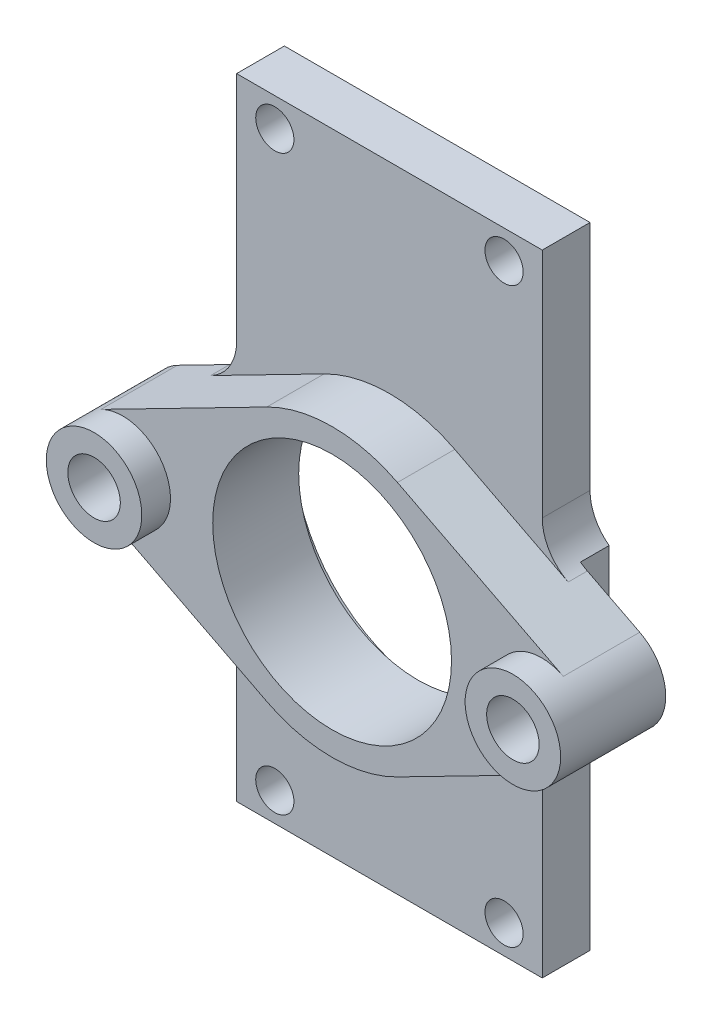
ISO-10303-21;
HEADER;
FILE_DESCRIPTION(('STEP AP214'),'2;1');
FILE_NAME('part.step','',(''),(''),'','','');
FILE_SCHEMA(('AUTOMOTIVE_DESIGN { 1 0 10303 214 1 1 1 1 }'));
ENDSEC;
DATA;
#1=APPLICATION_CONTEXT('core data for automotive mechanical design processes');
#2=APPLICATION_PROTOCOL_DEFINITION('international standard','automotive_design',2000,#1);
#3=PRODUCT_CONTEXT('',#1,'mechanical');
#4=PRODUCT('Part','Part','',(#3));
#5=PRODUCT_RELATED_PRODUCT_CATEGORY('part','',(#4));
#6=PRODUCT_DEFINITION_FORMATION('','',#4);
#7=PRODUCT_DEFINITION_CONTEXT('part definition',#1,'design');
#8=PRODUCT_DEFINITION('design','',#6,#7);
#9=PRODUCT_DEFINITION_SHAPE('','',#8);
#10=(LENGTH_UNIT() NAMED_UNIT(*) SI_UNIT(.MILLI.,.METRE.));
#11=(NAMED_UNIT(*) PLANE_ANGLE_UNIT() SI_UNIT($,.RADIAN.));
#12=(NAMED_UNIT(*) SI_UNIT($,.STERADIAN.) SOLID_ANGLE_UNIT());
#13=UNCERTAINTY_MEASURE_WITH_UNIT(LENGTH_MEASURE(1.E-05),#10,'distance_accuracy_value','');
#14=(GEOMETRIC_REPRESENTATION_CONTEXT(3) GLOBAL_UNCERTAINTY_ASSIGNED_CONTEXT((#13)) GLOBAL_UNIT_ASSIGNED_CONTEXT((#10,
#11,#12)) REPRESENTATION_CONTEXT('',''));
#15=CARTESIAN_POINT('',(0.,0.,0.));
#16=DIRECTION('',(0.,0.,1.));
#17=DIRECTION('',(1.,0.,0.));
#18=AXIS2_PLACEMENT_3D('',#15,#16,#17);
#19=CARTESIAN_POINT('',(16.,-30.,-3.));
#20=DIRECTION('',(0.,0.,1.));
#21=DIRECTION('',(1.,0.,0.));
#22=AXIS2_PLACEMENT_3D('',#19,#20,#21);
#23=PLANE('',#22);
#24=CARTESIAN_POINT('',(12.,33.,-3.));
#25=DIRECTION('',(0.,0.,-1.));
#26=DIRECTION('',(-1.,0.,0.));
#27=AXIS2_PLACEMENT_3D('',#24,#25,#26);
#28=CIRCLE('',#27,2.);
#29=CARTESIAN_POINT('',(9.99999999999999,33.,-3.));
#30=VERTEX_POINT('',#29);
#31=EDGE_CURVE('E370',#30,#30,#28,.T.);
#32=ORIENTED_EDGE('',*,*,#31,.F.);
#33=EDGE_LOOP('',(#32));
#34=FACE_BOUND('',#33,.T.);
#35=CARTESIAN_POINT('',(12.,-27.,-3.));
#36=DIRECTION('',(0.,0.,-1.));
#37=DIRECTION('',(-1.,0.,0.));
#38=AXIS2_PLACEMENT_3D('',#35,#36,#37);
#39=CIRCLE('',#38,2.);
#40=CARTESIAN_POINT('',(10.,-27.,-3.));
#41=VERTEX_POINT('',#40);
#42=EDGE_CURVE('E364',#41,#41,#39,.T.);
#43=ORIENTED_EDGE('',*,*,#42,.F.);
#44=EDGE_LOOP('',(#43));
#45=FACE_BOUND('',#44,.T.);
#46=DIRECTION('',(0.,-1.,0.));
#47=VECTOR('',#46,1.);
#48=CARTESIAN_POINT('',(16.,36.,-3.));
#49=LINE('',#48,#47);
#50=CARTESIAN_POINT('',(16.,36.,-3.));
#51=VERTEX_POINT('',#50);
#52=CARTESIAN_POINT('',(16.,11.7109346519563,-3.));
#53=VERTEX_POINT('',#52);
#54=EDGE_CURVE('E242',#51,#53,#49,.T.);
#55=ORIENTED_EDGE('',*,*,#54,.T.);
#56=CARTESIAN_POINT('',(21.,11.7109346519563,-3.));
#57=DIRECTION('',(0.,0.,1.));
#58=DIRECTION('',(1.,0.,0.));
#59=AXIS2_PLACEMENT_3D('',#56,#57,#58);
#60=CIRCLE('',#59,5.);
#61=CARTESIAN_POINT('',(18.,7.71093465195555,-3.));
#62=VERTEX_POINT('',#61);
#63=EDGE_CURVE('E321',#53,#62,#60,.T.);
#64=ORIENTED_EDGE('',*,*,#63,.T.);
#65=DIRECTION('',(0.,-1.,0.));
#66=VECTOR('',#65,1.);
#67=CARTESIAN_POINT('',(18.,7.63004549807436,-3.));
#68=LINE('',#67,#66);
#69=CARTESIAN_POINT('',(18.,-7.71093465195555,-3.));
#70=VERTEX_POINT('',#69);
#71=EDGE_CURVE('E47',#62,#70,#68,.T.);
#72=ORIENTED_EDGE('',*,*,#71,.T.);
#73=CARTESIAN_POINT('',(21.,-11.7109346519563,-3.));
#74=DIRECTION('',(0.,0.,1.));
#75=DIRECTION('',(1.,0.,0.));
#76=AXIS2_PLACEMENT_3D('',#73,#74,#75);
#77=CIRCLE('',#76,5.);
#78=CARTESIAN_POINT('',(16.,-11.7109346519563,-3.));
#79=VERTEX_POINT('',#78);
#80=EDGE_CURVE('E39',#70,#79,#77,.T.);
#81=ORIENTED_EDGE('',*,*,#80,.T.);
#82=CARTESIAN_POINT('',(16.,-30.,-3.));
#83=VERTEX_POINT('',#82);
#84=EDGE_CURVE('E241',#79,#83,#49,.T.);
#85=ORIENTED_EDGE('',*,*,#84,.T.);
#86=DIRECTION('',(1.,0.,0.));
#87=VECTOR('',#86,1.);
#88=CARTESIAN_POINT('',(-16.,-30.,-3.));
#89=LINE('',#88,#87);
#90=CARTESIAN_POINT('',(-16.,-30.,-3.));
#91=VERTEX_POINT('',#90);
#92=EDGE_CURVE('E212',#91,#83,#89,.T.);
#93=ORIENTED_EDGE('',*,*,#92,.F.);
#94=DIRECTION('',(0.,1.,0.));
#95=VECTOR('',#94,1.);
#96=CARTESIAN_POINT('',(-16.,-30.,-3.));
#97=LINE('',#96,#95);
#98=CARTESIAN_POINT('',(-16.,-11.7109346519563,-3.));
#99=VERTEX_POINT('',#98);
#100=EDGE_CURVE('E247',#91,#99,#97,.T.);
#101=ORIENTED_EDGE('',*,*,#100,.T.);
#102=CARTESIAN_POINT('',(-21.,-11.7109346519563,-3.));
#103=DIRECTION('',(0.,0.,1.));
#104=DIRECTION('',(1.,0.,0.));
#105=AXIS2_PLACEMENT_3D('',#102,#103,#104);
#106=CIRCLE('',#105,5.);
#107=CARTESIAN_POINT('',(-18.,-7.71093465195554,-3.));
#108=VERTEX_POINT('',#107);
#109=EDGE_CURVE('E340',#99,#108,#106,.T.);
#110=ORIENTED_EDGE('',*,*,#109,.T.);
#111=DIRECTION('',(0.,-1.,0.));
#112=VECTOR('',#111,1.);
#113=CARTESIAN_POINT('',(-18.,7.63004549807436,-3.));
#114=LINE('',#113,#112);
#115=CARTESIAN_POINT('',(-18.,7.71093465195555,-3.));
#116=VERTEX_POINT('',#115);
#117=EDGE_CURVE('E405',#116,#108,#114,.T.);
#118=ORIENTED_EDGE('',*,*,#117,.F.);
#119=CARTESIAN_POINT('',(-21.,11.7109346519563,-3.));
#120=DIRECTION('',(0.,0.,1.));
#121=DIRECTION('',(1.,0.,0.));
#122=AXIS2_PLACEMENT_3D('',#119,#120,#121);
#123=CIRCLE('',#122,5.);
#124=CARTESIAN_POINT('',(-16.,11.7109346519563,-3.));
#125=VERTEX_POINT('',#124);
#126=EDGE_CURVE('E335',#116,#125,#123,.T.);
#127=ORIENTED_EDGE('',*,*,#126,.T.);
#128=CARTESIAN_POINT('',(-16.,36.,-3.));
#129=VERTEX_POINT('',#128);
#130=EDGE_CURVE('E246',#125,#129,#97,.T.);
#131=ORIENTED_EDGE('',*,*,#130,.T.);
#132=DIRECTION('',(-1.,0.,0.));
#133=VECTOR('',#132,1.);
#134=CARTESIAN_POINT('',(16.,36.,-3.));
#135=LINE('',#134,#133);
#136=EDGE_CURVE('E250',#51,#129,#135,.T.);
#137=ORIENTED_EDGE('',*,*,#136,.F.);
#138=EDGE_LOOP('',(#55,#64,#72,#81,#85,#93,#101,#110,#118,#127,#131,#137));
#139=FACE_BOUND('',#138,.T.);
#140=CARTESIAN_POINT('',(0.,0.,-3.));
#141=DIRECTION('',(0.,0.,-1.));
#142=DIRECTION('',(-1.,0.,0.));
#143=AXIS2_PLACEMENT_3D('',#140,#141,#142);
#144=CIRCLE('',#143,15.);
#145=CARTESIAN_POINT('',(-15.,0.,-3.));
#146=VERTEX_POINT('',#145);
#147=EDGE_CURVE('E396',#146,#146,#144,.T.);
#148=ORIENTED_EDGE('',*,*,#147,.F.);
#149=EDGE_LOOP('',(#148));
#150=FACE_BOUND('',#149,.T.);
#151=CARTESIAN_POINT('',(-12.,-27.,-3.));
#152=DIRECTION('',(0.,0.,-1.));
#153=DIRECTION('',(-1.,0.,0.));
#154=AXIS2_PLACEMENT_3D('',#151,#152,#153);
#155=CIRCLE('',#154,2.);
#156=CARTESIAN_POINT('',(-14.,-27.,-3.));
#157=VERTEX_POINT('',#156);
#158=EDGE_CURVE('E367',#157,#157,#155,.T.);
#159=ORIENTED_EDGE('',*,*,#158,.F.);
#160=EDGE_LOOP('',(#159));
#161=FACE_BOUND('',#160,.T.);
#162=CARTESIAN_POINT('',(-12.,33.,-3.));
#163=DIRECTION('',(0.,0.,-1.));
#164=DIRECTION('',(-1.,0.,0.));
#165=AXIS2_PLACEMENT_3D('',#162,#163,#164);
#166=CIRCLE('',#165,2.);
#167=CARTESIAN_POINT('',(-14.,33.,-3.));
#168=VERTEX_POINT('',#167);
#169=EDGE_CURVE('E380',#168,#168,#166,.T.);
#170=ORIENTED_EDGE('',*,*,#169,.F.);
#171=EDGE_LOOP('',(#170));
#172=FACE_BOUND('',#171,.T.);
#173=ADVANCED_FACE('F30',(#34,#45,#139,#150,#161,#172),#23,.F.);
#174=CARTESIAN_POINT('',(16.,-30.,2.));
#175=DIRECTION('',(0.,0.,1.));
#176=DIRECTION('',(1.,0.,0.));
#177=AXIS2_PLACEMENT_3D('',#174,#175,#176);
#178=PLANE('',#177);
#179=CARTESIAN_POINT('',(12.,33.,2.));
#180=DIRECTION('',(0.,0.,1.));
#181=DIRECTION('',(1.,0.,0.));
#182=AXIS2_PLACEMENT_3D('',#179,#180,#181);
#183=CIRCLE('',#182,2.);
#184=CARTESIAN_POINT('',(14.,33.,2.));
#185=VERTEX_POINT('',#184);
#186=EDGE_CURVE('E368',#185,#185,#183,.F.);
#187=ORIENTED_EDGE('',*,*,#186,.T.);
#188=EDGE_LOOP('',(#187));
#189=FACE_BOUND('',#188,.T.);
#190=DIRECTION('',(-0.88992835552017,-0.456100342075256,0.));
#191=VECTOR('',#190,1.);
#192=CARTESIAN_POINT('',(-6.84150513112884,13.3489253328026,2.));
#193=LINE('',#192,#191);
#194=CARTESIAN_POINT('',(-6.84150513112884,13.3489253328026,2.));
#195=VERTEX_POINT('',#194);
#196=CARTESIAN_POINT('',(-18.7194982896237,7.26129287435542,2.));
#197=VERTEX_POINT('',#196);
#198=EDGE_CURVE('E233',#195,#197,#193,.T.);
#199=ORIENTED_EDGE('',*,*,#198,.F.);
#200=CARTESIAN_POINT('',(0.,0.,2.));
#201=DIRECTION('',(0.,0.,1.));
#202=DIRECTION('',(1.,0.,0.));
#203=AXIS2_PLACEMENT_3D('',#200,#201,#202);
#204=CIRCLE('',#203,15.);
#205=CARTESIAN_POINT('',(6.84150513112884,13.3489253328025,2.));
#206=VERTEX_POINT('',#205);
#207=EDGE_CURVE('E230',#206,#195,#204,.T.);
#208=ORIENTED_EDGE('',*,*,#207,.F.);
#209=DIRECTION('',(0.88992835552017,-0.456100342075256,0.));
#210=VECTOR('',#209,1.);
#211=CARTESIAN_POINT('',(6.84150513112884,13.3489253328025,2.));
#212=LINE('',#211,#210);
#213=CARTESIAN_POINT('',(18.7194982896237,7.26129287435541,2.));
#214=VERTEX_POINT('',#213);
#215=EDGE_CURVE('E298',#206,#214,#212,.T.);
#216=ORIENTED_EDGE('',*,*,#215,.T.);
#217=CARTESIAN_POINT('',(21.,11.7109346519563,2.));
#218=DIRECTION('',(0.,0.,1.));
#219=DIRECTION('',(1.,0.,0.));
#220=AXIS2_PLACEMENT_3D('',#217,#218,#219);
#221=CIRCLE('',#220,5.);
#222=CARTESIAN_POINT('',(16.,11.7109346519563,2.));
#223=VERTEX_POINT('',#222);
#224=EDGE_CURVE('E327',#214,#223,#221,.F.);
#225=ORIENTED_EDGE('',*,*,#224,.T.);
#226=DIRECTION('',(0.,-1.,0.));
#227=VECTOR('',#226,1.);
#228=CARTESIAN_POINT('',(16.,36.,2.));
#229=LINE('',#228,#227);
#230=CARTESIAN_POINT('',(16.,36.,2.));
#231=VERTEX_POINT('',#230);
#232=EDGE_CURVE('E204',#231,#223,#229,.T.);
#233=ORIENTED_EDGE('',*,*,#232,.F.);
#234=DIRECTION('',(-1.,0.,0.));
#235=VECTOR('',#234,1.);
#236=CARTESIAN_POINT('',(16.,36.,2.));
#237=LINE('',#236,#235);
#238=CARTESIAN_POINT('',(-16.,36.,2.));
#239=VERTEX_POINT('',#238);
#240=EDGE_CURVE('E227',#231,#239,#237,.T.);
#241=ORIENTED_EDGE('',*,*,#240,.T.);
#242=DIRECTION('',(0.,1.,0.));
#243=VECTOR('',#242,1.);
#244=CARTESIAN_POINT('',(-16.,-30.,2.));
#245=LINE('',#244,#243);
#246=CARTESIAN_POINT('',(-16.,11.7109346519563,2.));
#247=VERTEX_POINT('',#246);
#248=EDGE_CURVE('E221',#247,#239,#245,.T.);
#249=ORIENTED_EDGE('',*,*,#248,.F.);
#250=CARTESIAN_POINT('',(-21.,11.7109346519563,2.));
#251=DIRECTION('',(0.,0.,1.));
#252=DIRECTION('',(1.,0.,0.));
#253=AXIS2_PLACEMENT_3D('',#250,#251,#252);
#254=CIRCLE('',#253,5.);
#255=EDGE_CURVE('E337',#247,#197,#254,.F.);
#256=ORIENTED_EDGE('',*,*,#255,.T.);
#257=EDGE_LOOP('',(#199,#208,#216,#225,#233,#241,#249,#256));
#258=FACE_BOUND('',#257,.T.);
#259=CARTESIAN_POINT('',(-12.,33.,2.));
#260=DIRECTION('',(0.,0.,1.));
#261=DIRECTION('',(1.,0.,0.));
#262=AXIS2_PLACEMENT_3D('',#259,#260,#261);
#263=CIRCLE('',#262,2.);
#264=CARTESIAN_POINT('',(-10.,33.,2.));
#265=VERTEX_POINT('',#264);
#266=EDGE_CURVE('E34',#265,#265,#263,.F.);
#267=ORIENTED_EDGE('',*,*,#266,.T.);
#268=EDGE_LOOP('',(#267));
#269=FACE_BOUND('',#268,.T.);
#270=ADVANCED_FACE('F473',(#189,#258,#269),#178,.T.);
#271=CARTESIAN_POINT('',(12.,-27.,2.));
#272=DIRECTION('',(0.,0.,1.));
#273=DIRECTION('',(1.,0.,0.));
#274=AXIS2_PLACEMENT_3D('',#271,#272,#273);
#275=CIRCLE('',#274,2.);
#276=CARTESIAN_POINT('',(14.,-27.,2.));
#277=VERTEX_POINT('',#276);
#278=EDGE_CURVE('E360',#277,#277,#275,.F.);
#279=ORIENTED_EDGE('',*,*,#278,.T.);
#280=EDGE_LOOP('',(#279));
#281=FACE_BOUND('',#280,.T.);
#282=CARTESIAN_POINT('',(0.,0.,2.));
#283=DIRECTION('',(0.,0.,1.));
#284=DIRECTION('',(1.,0.,0.));
#285=AXIS2_PLACEMENT_3D('',#282,#283,#284);
#286=CIRCLE('',#285,15.);
#287=CARTESIAN_POINT('',(-6.84150513112886,-13.3489253328026,2.));
#288=VERTEX_POINT('',#287);
#289=CARTESIAN_POINT('',(6.84150513112885,-13.3489253328026,2.));
#290=VERTEX_POINT('',#289);
#291=EDGE_CURVE('E237',#288,#290,#286,.T.);
#292=ORIENTED_EDGE('',*,*,#291,.F.);
#293=DIRECTION('',(-0.88992835552017,0.456100342075257,0.));
#294=VECTOR('',#293,1.);
#295=CARTESIAN_POINT('',(-6.84150513112886,-13.3489253328026,2.));
#296=LINE('',#295,#294);
#297=CARTESIAN_POINT('',(-18.7194982896237,-7.26129287435542,2.));
#298=VERTEX_POINT('',#297);
#299=EDGE_CURVE('E239',#288,#298,#296,.T.);
#300=ORIENTED_EDGE('',*,*,#299,.T.);
#301=CARTESIAN_POINT('',(-21.,-11.7109346519563,2.));
#302=DIRECTION('',(0.,0.,1.));
#303=DIRECTION('',(1.,0.,0.));
#304=AXIS2_PLACEMENT_3D('',#301,#302,#303);
#305=CIRCLE('',#304,5.);
#306=CARTESIAN_POINT('',(-16.,-11.7109346519563,2.));
#307=VERTEX_POINT('',#306);
#308=EDGE_CURVE('E348',#298,#307,#305,.F.);
#309=ORIENTED_EDGE('',*,*,#308,.T.);
#310=CARTESIAN_POINT('',(-16.,-30.,2.));
#311=VERTEX_POINT('',#310);
#312=EDGE_CURVE('E220',#311,#307,#245,.T.);
#313=ORIENTED_EDGE('',*,*,#312,.F.);
#314=DIRECTION('',(1.,0.,0.));
#315=VECTOR('',#314,1.);
#316=CARTESIAN_POINT('',(-16.,-30.,2.));
#317=LINE('',#316,#315);
#318=CARTESIAN_POINT('',(16.,-30.,2.));
#319=VERTEX_POINT('',#318);
#320=EDGE_CURVE('E209',#311,#319,#317,.T.);
#321=ORIENTED_EDGE('',*,*,#320,.T.);
#322=CARTESIAN_POINT('',(16.,-11.7109346519563,2.));
#323=VERTEX_POINT('',#322);
#324=EDGE_CURVE('E193',#323,#319,#229,.T.);
#325=ORIENTED_EDGE('',*,*,#324,.F.);
#326=CARTESIAN_POINT('',(21.,-11.7109346519563,2.));
#327=DIRECTION('',(0.,0.,1.));
#328=DIRECTION('',(1.,0.,0.));
#329=AXIS2_PLACEMENT_3D('',#326,#327,#328);
#330=CIRCLE('',#329,5.);
#331=CARTESIAN_POINT('',(18.7194982896237,-7.26129287435541,2.));
#332=VERTEX_POINT('',#331);
#333=EDGE_CURVE('E11',#323,#332,#330,.F.);
#334=ORIENTED_EDGE('',*,*,#333,.T.);
#335=DIRECTION('',(0.88992835552017,0.456100342075257,0.));
#336=VECTOR('',#335,1.);
#337=CARTESIAN_POINT('',(6.84150513112885,-13.3489253328026,2.));
#338=LINE('',#337,#336);
#339=EDGE_CURVE('E235',#290,#332,#338,.T.);
#340=ORIENTED_EDGE('',*,*,#339,.F.);
#341=EDGE_LOOP('',(#292,#300,#309,#313,#321,#325,#334,#340));
#342=FACE_BOUND('',#341,.T.);
#343=CARTESIAN_POINT('',(-12.,-27.,2.));
#344=DIRECTION('',(0.,0.,1.));
#345=DIRECTION('',(1.,0.,0.));
#346=AXIS2_PLACEMENT_3D('',#343,#344,#345);
#347=CIRCLE('',#346,2.);
#348=CARTESIAN_POINT('',(-9.99999999999999,-27.,2.));
#349=VERTEX_POINT('',#348);
#350=EDGE_CURVE('E365',#349,#349,#347,.F.);
#351=ORIENTED_EDGE('',*,*,#350,.T.);
#352=EDGE_LOOP('',(#351));
#353=FACE_BOUND('',#352,.T.);
#354=ADVANCED_FACE('F217',(#281,#342,#353),#178,.T.);
#355=CARTESIAN_POINT('',(0.,0.,0.));
#356=DIRECTION('',(0.,0.,1.));
#357=DIRECTION('',(1.,0.,0.));
#358=AXIS2_PLACEMENT_3D('',#355,#356,#357);
#359=PLANE('',#358);
#360=DIRECTION('',(-0.88992835552017,-0.456100342075256,0.));
#361=VECTOR('',#360,1.);
#362=CARTESIAN_POINT('',(-6.84150513112884,13.3489253328026,0.));
#363=LINE('',#362,#361);
#364=CARTESIAN_POINT('',(-18.7194982896237,7.26129287435543,0.));
#365=VERTEX_POINT('',#364);
#366=CARTESIAN_POINT('',(-24.2055017103763,4.44964177760086,0.));
#367=VERTEX_POINT('',#366);
#368=EDGE_CURVE('E267',#365,#367,#363,.T.);
#369=ORIENTED_EDGE('',*,*,#368,.F.);
#370=CARTESIAN_POINT('',(-21.,11.7109346519563,0.));
#371=DIRECTION('',(0.,0.,1.));
#372=DIRECTION('',(1.,0.,0.));
#373=AXIS2_PLACEMENT_3D('',#370,#371,#372);
#374=CIRCLE('',#373,5.);
#375=CARTESIAN_POINT('',(-18.,7.71093465195555,0.));
#376=VERTEX_POINT('',#375);
#377=EDGE_CURVE('E329',#365,#376,#374,.T.);
#378=ORIENTED_EDGE('',*,*,#377,.T.);
#379=DIRECTION('',(0.,-1.,0.));
#380=VECTOR('',#379,1.);
#381=CARTESIAN_POINT('',(-18.,7.63004549807436,0.));
#382=LINE('',#381,#380);
#383=CARTESIAN_POINT('',(-18.,-7.71093465195554,0.));
#384=VERTEX_POINT('',#383);
#385=EDGE_CURVE('E358',#376,#384,#382,.T.);
#386=ORIENTED_EDGE('',*,*,#385,.T.);
#387=CARTESIAN_POINT('',(-21.,-11.7109346519563,0.));
#388=DIRECTION('',(0.,0.,1.));
#389=DIRECTION('',(1.,0.,0.));
#390=AXIS2_PLACEMENT_3D('',#387,#388,#389);
#391=CIRCLE('',#390,5.);
#392=CARTESIAN_POINT('',(-18.7194982896237,-7.26129287435542,0.));
#393=VERTEX_POINT('',#392);
#394=EDGE_CURVE('E346',#384,#393,#391,.T.);
#395=ORIENTED_EDGE('',*,*,#394,.T.);
#396=DIRECTION('',(-0.88992835552017,0.456100342075257,0.));
#397=VECTOR('',#396,1.);
#398=CARTESIAN_POINT('',(-6.84150513112886,-13.3489253328026,0.));
#399=LINE('',#398,#397);
#400=CARTESIAN_POINT('',(-24.2055017103763,-4.44964177760084,0.));
#401=VERTEX_POINT('',#400);
#402=EDGE_CURVE('E426',#393,#401,#399,.T.);
#403=ORIENTED_EDGE('',*,*,#402,.T.);
#404=CARTESIAN_POINT('',(-21.925,0.,0.));
#405=DIRECTION('',(0.,0.,-1.));
#406=DIRECTION('',(-1.,0.,0.));
#407=AXIS2_PLACEMENT_3D('',#404,#405,#406);
#408=CIRCLE('',#407,5.);
#409=EDGE_CURVE('E435',#401,#367,#408,.T.);
#410=ORIENTED_EDGE('',*,*,#409,.T.);
#411=EDGE_LOOP('',(#369,#378,#386,#395,#403,#410));
#412=FACE_BOUND('',#411,.T.);
#413=CARTESIAN_POINT('',(-21.925,0.,0.));
#414=DIRECTION('',(0.,0.,-1.));
#415=DIRECTION('',(-1.,0.,0.));
#416=AXIS2_PLACEMENT_3D('',#413,#414,#415);
#417=CIRCLE('',#416,2.75);
#418=CARTESIAN_POINT('',(-24.675,0.,0.));
#419=VERTEX_POINT('',#418);
#420=EDGE_CURVE('E363',#419,#419,#417,.T.);
#421=ORIENTED_EDGE('',*,*,#420,.F.);
#422=EDGE_LOOP('',(#421));
#423=FACE_BOUND('',#422,.T.);
#424=ADVANCED_FACE('F423',(#412,#423),#359,.F.);
#425=CARTESIAN_POINT('',(-21.925,0.,11.));
#426=DIRECTION('',(0.,0.,-1.));
#427=DIRECTION('',(-1.,0.,0.));
#428=AXIS2_PLACEMENT_3D('',#425,#426,#427);
#429=PLANE('',#428);
#430=CARTESIAN_POINT('',(-21.925,0.,11.));
#431=DIRECTION('',(0.,0.,-1.));
#432=DIRECTION('',(-1.,0.,0.));
#433=AXIS2_PLACEMENT_3D('',#430,#431,#432);
#434=CIRCLE('',#433,5.);
#435=CARTESIAN_POINT('',(-26.925,0.,11.));
#436=VERTEX_POINT('',#435);
#437=EDGE_CURVE('E260',#436,#436,#434,.T.);
#438=ORIENTED_EDGE('',*,*,#437,.F.);
#439=EDGE_LOOP('',(#438));
#440=FACE_BOUND('',#439,.T.);
#441=CARTESIAN_POINT('',(-21.925,0.,11.));
#442=DIRECTION('',(0.,0.,-1.));
#443=DIRECTION('',(-1.,0.,0.));
#444=AXIS2_PLACEMENT_3D('',#441,#442,#443);
#445=CIRCLE('',#444,2.75);
#446=CARTESIAN_POINT('',(-24.675,0.,11.));
#447=VERTEX_POINT('',#446);
#448=EDGE_CURVE('E387',#447,#447,#445,.T.);
#449=ORIENTED_EDGE('',*,*,#448,.T.);
#450=EDGE_LOOP('',(#449));
#451=FACE_BOUND('',#450,.T.);
#452=ADVANCED_FACE('F801',(#440,#451),#429,.F.);
#453=DIRECTION('',(0.,-1.,0.));
#454=VECTOR('',#453,1.);
#455=CARTESIAN_POINT('',(18.,7.63004549807436,0.));
#456=LINE('',#455,#454);
#457=CARTESIAN_POINT('',(18.,7.71093465195555,0.));
#458=VERTEX_POINT('',#457);
#459=CARTESIAN_POINT('',(18.,-7.71093465195555,0.));
#460=VERTEX_POINT('',#459);
#461=EDGE_CURVE('E54',#458,#460,#456,.T.);
#462=ORIENTED_EDGE('',*,*,#461,.F.);
#463=CARTESIAN_POINT('',(21.,11.7109346519563,0.));
#464=DIRECTION('',(0.,0.,1.));
#465=DIRECTION('',(1.,0.,0.));
#466=AXIS2_PLACEMENT_3D('',#463,#464,#465);
#467=CIRCLE('',#466,5.);
#468=CARTESIAN_POINT('',(18.7194982896237,7.26129287435541,0.));
#469=VERTEX_POINT('',#468);
#470=EDGE_CURVE('E325',#458,#469,#467,.T.);
#471=ORIENTED_EDGE('',*,*,#470,.T.);
#472=DIRECTION('',(0.88992835552017,-0.456100342075256,0.));
#473=VECTOR('',#472,1.);
#474=CARTESIAN_POINT('',(6.84150513112884,13.3489253328025,0.));
#475=LINE('',#474,#473);
#476=CARTESIAN_POINT('',(24.2055017103763,4.44964177760086,0.));
#477=VERTEX_POINT('',#476);
#478=EDGE_CURVE('E442',#469,#477,#475,.T.);
#479=ORIENTED_EDGE('',*,*,#478,.T.);
#480=CARTESIAN_POINT('',(21.925,0.,0.));
#481=DIRECTION('',(0.,0.,1.));
#482=DIRECTION('',(1.,0.,0.));
#483=AXIS2_PLACEMENT_3D('',#480,#481,#482);
#484=CIRCLE('',#483,5.);
#485=CARTESIAN_POINT('',(24.2055017103763,-4.44964177760085,0.));
#486=VERTEX_POINT('',#485);
#487=EDGE_CURVE('E437',#486,#477,#484,.T.);
#488=ORIENTED_EDGE('',*,*,#487,.F.);
#489=DIRECTION('',(0.88992835552017,0.456100342075257,0.));
#490=VECTOR('',#489,1.);
#491=CARTESIAN_POINT('',(6.84150513112885,-13.3489253328026,0.));
#492=LINE('',#491,#490);
#493=CARTESIAN_POINT('',(18.7194982896237,-7.26129287435541,0.));
#494=VERTEX_POINT('',#493);
#495=EDGE_CURVE('E434',#494,#486,#492,.T.);
#496=ORIENTED_EDGE('',*,*,#495,.F.);
#497=CARTESIAN_POINT('',(21.,-11.7109346519563,0.));
#498=DIRECTION('',(0.,0.,1.));
#499=DIRECTION('',(1.,0.,0.));
#500=AXIS2_PLACEMENT_3D('',#497,#498,#499);
#501=CIRCLE('',#500,5.);
#502=EDGE_CURVE('E350',#494,#460,#501,.T.);
#503=ORIENTED_EDGE('',*,*,#502,.T.);
#504=EDGE_LOOP('',(#462,#471,#479,#488,#496,#503));
#505=FACE_BOUND('',#504,.T.);
#506=CARTESIAN_POINT('',(21.925,0.,0.));
#507=DIRECTION('',(0.,0.,-1.));
#508=DIRECTION('',(-1.,0.,0.));
#509=AXIS2_PLACEMENT_3D('',#506,#507,#508);
#510=CIRCLE('',#509,2.75);
#511=CARTESIAN_POINT('',(19.175,0.,0.));
#512=VERTEX_POINT('',#511);
#513=EDGE_CURVE('E390',#512,#512,#510,.T.);
#514=ORIENTED_EDGE('',*,*,#513,.F.);
#515=EDGE_LOOP('',(#514));
#516=FACE_BOUND('',#515,.T.);
#517=ADVANCED_FACE('F517',(#505,#516),#359,.F.);
#518=CARTESIAN_POINT('',(21.925,0.,11.));
#519=DIRECTION('',(0.,0.,1.));
#520=DIRECTION('',(1.,0.,0.));
#521=AXIS2_PLACEMENT_3D('',#518,#519,#520);
#522=PLANE('',#521);
#523=CARTESIAN_POINT('',(21.925,0.,11.));
#524=DIRECTION('',(0.,0.,1.));
#525=DIRECTION('',(1.,0.,0.));
#526=AXIS2_PLACEMENT_3D('',#523,#524,#525);
#527=CIRCLE('',#526,5.);
#528=CARTESIAN_POINT('',(26.925,0.,11.));
#529=VERTEX_POINT('',#528);
#530=EDGE_CURVE('E264',#529,#529,#527,.T.);
#531=ORIENTED_EDGE('',*,*,#530,.T.);
#532=EDGE_LOOP('',(#531));
#533=FACE_BOUND('',#532,.T.);
#534=CARTESIAN_POINT('',(21.925,0.,11.));
#535=DIRECTION('',(0.,0.,-1.));
#536=DIRECTION('',(-1.,0.,0.));
#537=AXIS2_PLACEMENT_3D('',#534,#535,#536);
#538=CIRCLE('',#537,2.75);
#539=CARTESIAN_POINT('',(19.175,0.,11.));
#540=VERTEX_POINT('',#539);
#541=EDGE_CURVE('E393',#540,#540,#538,.T.);
#542=ORIENTED_EDGE('',*,*,#541,.T.);
#543=EDGE_LOOP('',(#542));
#544=FACE_BOUND('',#543,.T.);
#545=ADVANCED_FACE('F533',(#533,#544),#522,.T.);
#546=CARTESIAN_POINT('',(0.,0.,8.));
#547=DIRECTION('',(0.,0.,1.));
#548=DIRECTION('',(1.,0.,0.));
#549=AXIS2_PLACEMENT_3D('',#546,#547,#548);
#550=PLANE('',#549);
#551=CARTESIAN_POINT('',(-21.925,0.,8.));
#552=DIRECTION('',(0.,0.,-1.));
#553=DIRECTION('',(-1.,0.,0.));
#554=AXIS2_PLACEMENT_3D('',#551,#552,#553);
#555=CIRCLE('',#554,5.);
#556=CARTESIAN_POINT('',(-24.2055017103763,4.44964177760086,8.));
#557=VERTEX_POINT('',#556);
#558=CARTESIAN_POINT('',(-24.2055017103763,-4.44964177760084,8.));
#559=VERTEX_POINT('',#558);
#560=EDGE_CURVE('E213',#557,#559,#555,.T.);
#561=ORIENTED_EDGE('',*,*,#560,.T.);
#562=DIRECTION('',(-0.88992835552017,0.456100342075257,0.));
#563=VECTOR('',#562,1.);
#564=CARTESIAN_POINT('',(-6.84150513112886,-13.3489253328026,8.));
#565=LINE('',#564,#563);
#566=CARTESIAN_POINT('',(-6.84150513112886,-13.3489253328026,8.));
#567=VERTEX_POINT('',#566);
#568=EDGE_CURVE('E450',#567,#559,#565,.T.);
#569=ORIENTED_EDGE('',*,*,#568,.F.);
#570=CARTESIAN_POINT('',(0.,0.,8.));
#571=DIRECTION('',(0.,0.,1.));
#572=DIRECTION('',(1.,0.,0.));
#573=AXIS2_PLACEMENT_3D('',#570,#571,#572);
#574=CIRCLE('',#573,15.);
#575=CARTESIAN_POINT('',(6.84150513112885,-13.3489253328026,8.));
#576=VERTEX_POINT('',#575);
#577=EDGE_CURVE('E290',#567,#576,#574,.T.);
#578=ORIENTED_EDGE('',*,*,#577,.T.);
#579=DIRECTION('',(0.88992835552017,0.456100342075257,0.));
#580=VECTOR('',#579,1.);
#581=CARTESIAN_POINT('',(6.84150513112885,-13.3489253328026,8.));
#582=LINE('',#581,#580);
#583=CARTESIAN_POINT('',(24.2055017103763,-4.44964177760085,8.));
#584=VERTEX_POINT('',#583);
#585=EDGE_CURVE('E280',#576,#584,#582,.T.);
#586=ORIENTED_EDGE('',*,*,#585,.T.);
#587=CARTESIAN_POINT('',(21.925,0.,8.));
#588=DIRECTION('',(0.,0.,1.));
#589=DIRECTION('',(1.,0.,0.));
#590=AXIS2_PLACEMENT_3D('',#587,#588,#589);
#591=CIRCLE('',#590,5.);
#592=CARTESIAN_POINT('',(24.2055017103763,4.44964177760085,8.));
#593=VERTEX_POINT('',#592);
#594=EDGE_CURVE('E263',#593,#584,#591,.T.);
#595=ORIENTED_EDGE('',*,*,#594,.F.);
#596=DIRECTION('',(0.88992835552017,-0.456100342075256,0.));
#597=VECTOR('',#596,1.);
#598=CARTESIAN_POINT('',(6.84150513112884,13.3489253328025,8.));
#599=LINE('',#598,#597);
#600=CARTESIAN_POINT('',(6.84150513112884,13.3489253328025,8.));
#601=VERTEX_POINT('',#600);
#602=EDGE_CURVE('E277',#601,#593,#599,.T.);
#603=ORIENTED_EDGE('',*,*,#602,.F.);
#604=CARTESIAN_POINT('',(0.,0.,8.));
#605=DIRECTION('',(0.,0.,1.));
#606=DIRECTION('',(1.,0.,0.));
#607=AXIS2_PLACEMENT_3D('',#604,#605,#606);
#608=CIRCLE('',#607,15.);
#609=CARTESIAN_POINT('',(-6.84150513112884,13.3489253328026,8.));
#610=VERTEX_POINT('',#609);
#611=EDGE_CURVE('E444',#601,#610,#608,.T.);
#612=ORIENTED_EDGE('',*,*,#611,.T.);
#613=DIRECTION('',(-0.88992835552017,-0.456100342075256,0.));
#614=VECTOR('',#613,1.);
#615=CARTESIAN_POINT('',(-6.84150513112884,13.3489253328026,8.));
#616=LINE('',#615,#614);
#617=EDGE_CURVE('E447',#610,#557,#616,.T.);
#618=ORIENTED_EDGE('',*,*,#617,.T.);
#619=EDGE_LOOP('',(#561,#569,#578,#586,#595,#603,#612,#618));
#620=FACE_BOUND('',#619,.T.);
#621=CARTESIAN_POINT('',(0.,0.,8.));
#622=DIRECTION('',(0.,0.,1.));
#623=DIRECTION('',(1.,0.,0.));
#624=AXIS2_PLACEMENT_3D('',#621,#622,#623);
#625=CIRCLE('',#624,12.5);
#626=CARTESIAN_POINT('',(12.5,0.,8.));
#627=VERTEX_POINT('',#626);
#628=EDGE_CURVE('E355',#627,#627,#625,.F.);
#629=ORIENTED_EDGE('',*,*,#628,.T.);
#630=EDGE_LOOP('',(#629));
#631=FACE_BOUND('',#630,.T.);
#632=ADVANCED_FACE('F505',(#620,#631),#550,.T.);
#633=CARTESIAN_POINT('',(-16.,-30.,-3.));
#634=DIRECTION('',(1.,0.,0.));
#635=DIRECTION('',(0.,0.,-1.));
#636=AXIS2_PLACEMENT_3D('',#633,#634,#635);
#637=PLANE('',#636);
#638=ORIENTED_EDGE('',*,*,#130,.F.);
#639=DIRECTION('',(0.,0.,-1.));
#640=VECTOR('',#639,1.);
#641=CARTESIAN_POINT('',(-16.,11.7109346519563,8.));
#642=LINE('',#641,#640);
#643=EDGE_CURVE('E309',#125,#247,#642,.F.);
#644=ORIENTED_EDGE('',*,*,#643,.T.);
#645=ORIENTED_EDGE('',*,*,#248,.T.);
#646=DIRECTION('',(0.,0.,1.));
#647=VECTOR('',#646,1.);
#648=CARTESIAN_POINT('',(-16.,36.,-3.));
#649=LINE('',#648,#647);
#650=EDGE_CURVE('E255',#129,#239,#649,.T.);
#651=ORIENTED_EDGE('',*,*,#650,.F.);
#652=EDGE_LOOP('',(#638,#644,#645,#651));
#653=FACE_BOUND('',#652,.T.);
#654=ADVANCED_FACE('F524',(#653),#637,.F.);
#655=CARTESIAN_POINT('',(16.,36.,-3.));
#656=DIRECTION('',(-1.,0.,0.));
#657=DIRECTION('',(0.,-1.,0.));
#658=AXIS2_PLACEMENT_3D('',#655,#656,#657);
#659=PLANE('',#658);
#660=ORIENTED_EDGE('',*,*,#84,.F.);
#661=DIRECTION('',(0.,0.,-1.));
#662=VECTOR('',#661,1.);
#663=CARTESIAN_POINT('',(16.,-11.7109346519563,8.));
#664=LINE('',#663,#662);
#665=EDGE_CURVE('E200',#79,#323,#664,.F.);
#666=ORIENTED_EDGE('',*,*,#665,.T.);
#667=ORIENTED_EDGE('',*,*,#324,.T.);
#668=DIRECTION('',(0.,0.,1.));
#669=VECTOR('',#668,1.);
#670=CARTESIAN_POINT('',(16.,-30.,-3.));
#671=LINE('',#670,#669);
#672=EDGE_CURVE('E197',#83,#319,#671,.T.);
#673=ORIENTED_EDGE('',*,*,#672,.F.);
#674=EDGE_LOOP('',(#660,#666,#667,#673));
#675=FACE_BOUND('',#674,.T.);
#676=ADVANCED_FACE('F196',(#675),#659,.F.);
#677=CARTESIAN_POINT('',(0.,0.,8.));
#678=DIRECTION('',(0.,0.,-1.));
#679=DIRECTION('',(-1.,0.,0.));
#680=AXIS2_PLACEMENT_3D('',#677,#678,#679);
#681=CYLINDRICAL_SURFACE('',#680,15.);
#682=DIRECTION('',(0.,0.,-1.));
#683=VECTOR('',#682,1.);
#684=CARTESIAN_POINT('',(6.84150513112884,13.3489253328025,8.));
#685=LINE('',#684,#683);
#686=EDGE_CURVE('E279',#601,#206,#685,.T.);
#687=ORIENTED_EDGE('',*,*,#686,.T.);
#688=ORIENTED_EDGE('',*,*,#207,.T.);
#689=DIRECTION('',(0.,0.,-1.));
#690=VECTOR('',#689,1.);
#691=CARTESIAN_POINT('',(-6.84150513112884,13.3489253328026,8.));
#692=LINE('',#691,#690);
#693=EDGE_CURVE('E275',#610,#195,#692,.T.);
#694=ORIENTED_EDGE('',*,*,#693,.F.);
#695=ORIENTED_EDGE('',*,*,#611,.F.);
#696=EDGE_LOOP('',(#687,#688,#694,#695));
#697=FACE_BOUND('',#696,.T.);
#698=ADVANCED_FACE('F32',(#697),#681,.T.);
#699=CARTESIAN_POINT('',(-6.84150513112884,13.3489253328026,8.));
#700=DIRECTION('',(0.456100342075256,-0.88992835552017,0.));
#701=DIRECTION('',(0.88992835552017,0.456100342075256,0.));
#702=AXIS2_PLACEMENT_3D('',#699,#700,#701);
#703=PLANE('',#702);
#704=ORIENTED_EDGE('',*,*,#198,.T.);
#705=DIRECTION('',(0.,0.,-1.));
#706=VECTOR('',#705,1.);
#707=CARTESIAN_POINT('',(-18.7194982896237,7.26129287435542,8.));
#708=LINE('',#707,#706);
#709=EDGE_CURVE('E306',#197,#365,#708,.T.);
#710=ORIENTED_EDGE('',*,*,#709,.T.);
#711=ORIENTED_EDGE('',*,*,#368,.T.);
#712=DIRECTION('',(0.,0.,-1.));
#713=VECTOR('',#712,1.);
#714=CARTESIAN_POINT('',(-24.2055017103763,4.44964177760086,8.));
#715=LINE('',#714,#713);
#716=EDGE_CURVE('E460',#557,#367,#715,.T.);
#717=ORIENTED_EDGE('',*,*,#716,.F.);
#718=ORIENTED_EDGE('',*,*,#617,.F.);
#719=ORIENTED_EDGE('',*,*,#693,.T.);
#720=EDGE_LOOP('',(#704,#710,#711,#717,#718,#719));
#721=FACE_BOUND('',#720,.T.);
#722=ADVANCED_FACE('F467',(#721),#703,.F.);
#723=CARTESIAN_POINT('',(-21.925,0.,8.));
#724=DIRECTION('',(0.,0.,-1.));
#725=DIRECTION('',(-1.,0.,0.));
#726=AXIS2_PLACEMENT_3D('',#723,#724,#725);
#727=CYLINDRICAL_SURFACE('',#726,5.);
#728=ORIENTED_EDGE('',*,*,#409,.F.);
#729=DIRECTION('',(0.,0.,-1.));
#730=VECTOR('',#729,1.);
#731=CARTESIAN_POINT('',(-24.2055017103763,-4.44964177760084,8.));
#732=LINE('',#731,#730);
#733=EDGE_CURVE('E432',#559,#401,#732,.T.);
#734=ORIENTED_EDGE('',*,*,#733,.F.);
#735=ORIENTED_EDGE('',*,*,#560,.F.);
#736=ORIENTED_EDGE('',*,*,#716,.T.);
#737=EDGE_LOOP('',(#728,#734,#735,#736));
#738=FACE_BOUND('',#737,.T.);
#739=ORIENTED_EDGE('',*,*,#437,.T.);
#740=EDGE_LOOP('',(#739));
#741=FACE_BOUND('',#740,.T.);
#742=ADVANCED_FACE('F500',(#738,#741),#727,.T.);
#743=CARTESIAN_POINT('',(-6.84150513112886,-13.3489253328026,8.));
#744=DIRECTION('',(-0.456100342075257,-0.88992835552017,0.));
#745=DIRECTION('',(0.88992835552017,-0.456100342075257,0.));
#746=AXIS2_PLACEMENT_3D('',#743,#744,#745);
#747=PLANE('',#746);
#748=ORIENTED_EDGE('',*,*,#402,.F.);
#749=DIRECTION('',(0.,0.,-1.));
#750=VECTOR('',#749,1.);
#751=CARTESIAN_POINT('',(-18.7194982896237,-7.26129287435542,8.));
#752=LINE('',#751,#750);
#753=EDGE_CURVE('E314',#393,#298,#752,.F.);
#754=ORIENTED_EDGE('',*,*,#753,.T.);
#755=ORIENTED_EDGE('',*,*,#299,.F.);
#756=DIRECTION('',(0.,0.,-1.));
#757=VECTOR('',#756,1.);
#758=CARTESIAN_POINT('',(-6.84150513112886,-13.3489253328026,8.));
#759=LINE('',#758,#757);
#760=EDGE_CURVE('E457',#567,#288,#759,.T.);
#761=ORIENTED_EDGE('',*,*,#760,.F.);
#762=ORIENTED_EDGE('',*,*,#568,.T.);
#763=ORIENTED_EDGE('',*,*,#733,.T.);
#764=EDGE_LOOP('',(#748,#754,#755,#761,#762,#763));
#765=FACE_BOUND('',#764,.T.);
#766=ADVANCED_FACE('F429',(#765),#747,.T.);
#767=CARTESIAN_POINT('',(0.,0.,8.));
#768=DIRECTION('',(0.,0.,-1.));
#769=DIRECTION('',(-1.,0.,0.));
#770=AXIS2_PLACEMENT_3D('',#767,#768,#769);
#771=CYLINDRICAL_SURFACE('',#770,15.);
#772=ORIENTED_EDGE('',*,*,#760,.T.);
#773=ORIENTED_EDGE('',*,*,#291,.T.);
#774=DIRECTION('',(0.,0.,-1.));
#775=VECTOR('',#774,1.);
#776=CARTESIAN_POINT('',(6.84150513112885,-13.3489253328026,8.));
#777=LINE('',#776,#775);
#778=EDGE_CURVE('E295',#576,#290,#777,.T.);
#779=ORIENTED_EDGE('',*,*,#778,.F.);
#780=ORIENTED_EDGE('',*,*,#577,.F.);
#781=EDGE_LOOP('',(#772,#773,#779,#780));
#782=FACE_BOUND('',#781,.T.);
#783=ADVANCED_FACE('F723',(#782),#771,.T.);
#784=CARTESIAN_POINT('',(6.84150513112885,-13.3489253328026,8.));
#785=DIRECTION('',(-0.456100342075257,0.88992835552017,0.));
#786=DIRECTION('',(-0.88992835552017,-0.456100342075257,0.));
#787=AXIS2_PLACEMENT_3D('',#784,#785,#786);
#788=PLANE('',#787);
#789=ORIENTED_EDGE('',*,*,#339,.T.);
#790=DIRECTION('',(0.,0.,-1.));
#791=VECTOR('',#790,1.);
#792=CARTESIAN_POINT('',(18.7194982896237,-7.26129287435541,8.));
#793=LINE('',#792,#791);
#794=EDGE_CURVE('E317',#332,#494,#793,.T.);
#795=ORIENTED_EDGE('',*,*,#794,.T.);
#796=ORIENTED_EDGE('',*,*,#495,.T.);
#797=DIRECTION('',(0.,0.,-1.));
#798=VECTOR('',#797,1.);
#799=CARTESIAN_POINT('',(24.2055017103763,-4.44964177760085,8.));
#800=LINE('',#799,#798);
#801=EDGE_CURVE('E286',#584,#486,#800,.T.);
#802=ORIENTED_EDGE('',*,*,#801,.F.);
#803=ORIENTED_EDGE('',*,*,#585,.F.);
#804=ORIENTED_EDGE('',*,*,#778,.T.);
#805=EDGE_LOOP('',(#789,#795,#796,#802,#803,#804));
#806=FACE_BOUND('',#805,.T.);
#807=ADVANCED_FACE('F713',(#806),#788,.F.);
#808=CARTESIAN_POINT('',(21.925,0.,8.));
#809=DIRECTION('',(0.,0.,-1.));
#810=DIRECTION('',(-1.,0.,0.));
#811=AXIS2_PLACEMENT_3D('',#808,#809,#810);
#812=CYLINDRICAL_SURFACE('',#811,5.);
#813=ORIENTED_EDGE('',*,*,#487,.T.);
#814=DIRECTION('',(0.,0.,-1.));
#815=VECTOR('',#814,1.);
#816=CARTESIAN_POINT('',(24.2055017103763,4.44964177760086,8.));
#817=LINE('',#816,#815);
#818=EDGE_CURVE('E283',#593,#477,#817,.T.);
#819=ORIENTED_EDGE('',*,*,#818,.F.);
#820=ORIENTED_EDGE('',*,*,#594,.T.);
#821=ORIENTED_EDGE('',*,*,#801,.T.);
#822=EDGE_LOOP('',(#813,#819,#820,#821));
#823=FACE_BOUND('',#822,.T.);
#824=ORIENTED_EDGE('',*,*,#530,.F.);
#825=EDGE_LOOP('',(#824));
#826=FACE_BOUND('',#825,.T.);
#827=ADVANCED_FACE('F511',(#823,#826),#812,.T.);
#828=CARTESIAN_POINT('',(6.84150513112884,13.3489253328025,8.));
#829=DIRECTION('',(0.456100342075256,0.88992835552017,0.));
#830=DIRECTION('',(-0.88992835552017,0.456100342075256,0.));
#831=AXIS2_PLACEMENT_3D('',#828,#829,#830);
#832=PLANE('',#831);
#833=ORIENTED_EDGE('',*,*,#478,.F.);
#834=DIRECTION('',(0.,0.,-1.));
#835=VECTOR('',#834,1.);
#836=CARTESIAN_POINT('',(18.7194982896237,7.26129287435541,8.));
#837=LINE('',#836,#835);
#838=EDGE_CURVE('E303',#469,#214,#837,.F.);
#839=ORIENTED_EDGE('',*,*,#838,.T.);
#840=ORIENTED_EDGE('',*,*,#215,.F.);
#841=ORIENTED_EDGE('',*,*,#686,.F.);
#842=ORIENTED_EDGE('',*,*,#602,.T.);
#843=ORIENTED_EDGE('',*,*,#818,.T.);
#844=EDGE_LOOP('',(#833,#839,#840,#841,#842,#843));
#845=FACE_BOUND('',#844,.T.);
#846=ADVANCED_FACE('F477',(#845),#832,.T.);
#847=ORIENTED_EDGE('',*,*,#232,.T.);
#848=DIRECTION('',(0.,0.,-1.));
#849=VECTOR('',#848,1.);
#850=CARTESIAN_POINT('',(16.,11.7109346519563,-3.));
#851=LINE('',#850,#849);
#852=EDGE_CURVE('E300',#223,#53,#851,.T.);
#853=ORIENTED_EDGE('',*,*,#852,.T.);
#854=ORIENTED_EDGE('',*,*,#54,.F.);
#855=DIRECTION('',(0.,0.,1.));
#856=VECTOR('',#855,1.);
#857=CARTESIAN_POINT('',(16.,36.,-3.));
#858=LINE('',#857,#856);
#859=EDGE_CURVE('E253',#51,#231,#858,.T.);
#860=ORIENTED_EDGE('',*,*,#859,.T.);
#861=EDGE_LOOP('',(#847,#853,#854,#860));
#862=FACE_BOUND('',#861,.T.);
#863=ADVANCED_FACE('F486',(#862),#659,.F.);
#864=CARTESIAN_POINT('',(-16.,-30.,-3.));
#865=DIRECTION('',(0.,-1.,0.));
#866=DIRECTION('',(0.,0.,-1.));
#867=AXIS2_PLACEMENT_3D('',#864,#865,#866);
#868=PLANE('',#867);
#869=ORIENTED_EDGE('',*,*,#672,.T.);
#870=ORIENTED_EDGE('',*,*,#320,.F.);
#871=DIRECTION('',(0.,0.,1.));
#872=VECTOR('',#871,1.);
#873=CARTESIAN_POINT('',(-16.,-30.,-3.));
#874=LINE('',#873,#872);
#875=EDGE_CURVE('E214',#91,#311,#874,.T.);
#876=ORIENTED_EDGE('',*,*,#875,.F.);
#877=ORIENTED_EDGE('',*,*,#92,.T.);
#878=EDGE_LOOP('',(#869,#870,#876,#877));
#879=FACE_BOUND('',#878,.T.);
#880=ADVANCED_FACE('F208',(#879),#868,.T.);
#881=ORIENTED_EDGE('',*,*,#312,.T.);
#882=DIRECTION('',(0.,0.,-1.));
#883=VECTOR('',#882,1.);
#884=CARTESIAN_POINT('',(-16.,-11.7109346519563,-3.));
#885=LINE('',#884,#883);
#886=EDGE_CURVE('E311',#307,#99,#885,.T.);
#887=ORIENTED_EDGE('',*,*,#886,.T.);
#888=ORIENTED_EDGE('',*,*,#100,.F.);
#889=ORIENTED_EDGE('',*,*,#875,.T.);
#890=EDGE_LOOP('',(#881,#887,#888,#889));
#891=FACE_BOUND('',#890,.T.);
#892=ADVANCED_FACE('F527',(#891),#637,.F.);
#893=CARTESIAN_POINT('',(16.,36.,-3.));
#894=DIRECTION('',(0.,1.,0.));
#895=DIRECTION('',(-1.,0.,0.));
#896=AXIS2_PLACEMENT_3D('',#893,#894,#895);
#897=PLANE('',#896);
#898=ORIENTED_EDGE('',*,*,#650,.T.);
#899=ORIENTED_EDGE('',*,*,#240,.F.);
#900=ORIENTED_EDGE('',*,*,#859,.F.);
#901=ORIENTED_EDGE('',*,*,#136,.T.);
#902=EDGE_LOOP('',(#898,#899,#900,#901));
#903=FACE_BOUND('',#902,.T.);
#904=ADVANCED_FACE('F491',(#903),#897,.T.);
#905=CARTESIAN_POINT('',(18.,7.63004549807436,-3.));
#906=DIRECTION('',(-1.,0.,0.));
#907=DIRECTION('',(0.,0.,1.));
#908=AXIS2_PLACEMENT_3D('',#905,#906,#907);
#909=PLANE('',#908);
#910=ORIENTED_EDGE('',*,*,#461,.T.);
#911=DIRECTION('',(0.,0.,1.));
#912=VECTOR('',#911,1.);
#913=CARTESIAN_POINT('',(18.,-7.71093465195555,0.));
#914=LINE('',#913,#912);
#915=EDGE_CURVE('E352',#460,#70,#914,.F.);
#916=ORIENTED_EDGE('',*,*,#915,.T.);
#917=ORIENTED_EDGE('',*,*,#71,.F.);
#918=DIRECTION('',(0.,0.,-1.));
#919=VECTOR('',#918,1.);
#920=CARTESIAN_POINT('',(18.,7.71093465195555,-3.));
#921=LINE('',#920,#919);
#922=EDGE_CURVE('E323',#62,#458,#921,.F.);
#923=ORIENTED_EDGE('',*,*,#922,.T.);
#924=EDGE_LOOP('',(#910,#916,#917,#923));
#925=FACE_BOUND('',#924,.T.);
#926=ADVANCED_FACE('F520',(#925),#909,.F.);
#927=CARTESIAN_POINT('',(-18.,7.63004549807436,-3.));
#928=DIRECTION('',(-1.,0.,0.));
#929=DIRECTION('',(0.,0.,1.));
#930=AXIS2_PLACEMENT_3D('',#927,#928,#929);
#931=PLANE('',#930);
#932=ORIENTED_EDGE('',*,*,#385,.F.);
#933=DIRECTION('',(0.,0.,1.));
#934=VECTOR('',#933,1.);
#935=CARTESIAN_POINT('',(-18.,7.71093465195555,0.));
#936=LINE('',#935,#934);
#937=EDGE_CURVE('E332',#376,#116,#936,.F.);
#938=ORIENTED_EDGE('',*,*,#937,.T.);
#939=ORIENTED_EDGE('',*,*,#117,.T.);
#940=DIRECTION('',(0.,0.,-1.));
#941=VECTOR('',#940,1.);
#942=CARTESIAN_POINT('',(-18.,-7.71093465195554,-3.));
#943=LINE('',#942,#941);
#944=EDGE_CURVE('E343',#108,#384,#943,.F.);
#945=ORIENTED_EDGE('',*,*,#944,.T.);
#946=EDGE_LOOP('',(#932,#938,#939,#945));
#947=FACE_BOUND('',#946,.T.);
#948=ADVANCED_FACE('F408',(#947),#931,.T.);
#949=CARTESIAN_POINT('',(21.,11.7109346519563,-3.));
#950=DIRECTION('',(0.,0.,-1.));
#951=DIRECTION('',(-1.,0.,0.));
#952=AXIS2_PLACEMENT_3D('',#949,#950,#951);
#953=CYLINDRICAL_SURFACE('',#952,5.);
#954=ORIENTED_EDGE('',*,*,#224,.F.);
#955=ORIENTED_EDGE('',*,*,#838,.F.);
#956=ORIENTED_EDGE('',*,*,#470,.F.);
#957=ORIENTED_EDGE('',*,*,#922,.F.);
#958=ORIENTED_EDGE('',*,*,#63,.F.);
#959=ORIENTED_EDGE('',*,*,#852,.F.);
#960=EDGE_LOOP('',(#954,#955,#956,#957,#958,#959));
#961=FACE_BOUND('',#960,.T.);
#962=ADVANCED_FACE('F483',(#961),#953,.F.);
#963=CARTESIAN_POINT('',(-21.,11.7109346519563,8.));
#964=DIRECTION('',(0.,0.,1.));
#965=DIRECTION('',(1.,0.,0.));
#966=AXIS2_PLACEMENT_3D('',#963,#964,#965);
#967=CYLINDRICAL_SURFACE('',#966,5.);
#968=ORIENTED_EDGE('',*,*,#255,.F.);
#969=ORIENTED_EDGE('',*,*,#643,.F.);
#970=ORIENTED_EDGE('',*,*,#126,.F.);
#971=ORIENTED_EDGE('',*,*,#937,.F.);
#972=ORIENTED_EDGE('',*,*,#377,.F.);
#973=ORIENTED_EDGE('',*,*,#709,.F.);
#974=EDGE_LOOP('',(#968,#969,#970,#971,#972,#973));
#975=FACE_BOUND('',#974,.T.);
#976=ADVANCED_FACE('F499',(#975),#967,.F.);
#977=CARTESIAN_POINT('',(-21.,-11.7109346519563,-3.));
#978=DIRECTION('',(0.,0.,-1.));
#979=DIRECTION('',(-1.,0.,0.));
#980=AXIS2_PLACEMENT_3D('',#977,#978,#979);
#981=CYLINDRICAL_SURFACE('',#980,5.);
#982=ORIENTED_EDGE('',*,*,#308,.F.);
#983=ORIENTED_EDGE('',*,*,#753,.F.);
#984=ORIENTED_EDGE('',*,*,#394,.F.);
#985=ORIENTED_EDGE('',*,*,#944,.F.);
#986=ORIENTED_EDGE('',*,*,#109,.F.);
#987=ORIENTED_EDGE('',*,*,#886,.F.);
#988=EDGE_LOOP('',(#982,#983,#984,#985,#986,#987));
#989=FACE_BOUND('',#988,.T.);
#990=ADVANCED_FACE('F418',(#989),#981,.F.);
#991=CARTESIAN_POINT('',(21.,-11.7109346519563,8.));
#992=DIRECTION('',(0.,0.,1.));
#993=DIRECTION('',(1.,0.,0.));
#994=AXIS2_PLACEMENT_3D('',#991,#992,#993);
#995=CYLINDRICAL_SURFACE('',#994,5.);
#996=ORIENTED_EDGE('',*,*,#333,.F.);
#997=ORIENTED_EDGE('',*,*,#665,.F.);
#998=ORIENTED_EDGE('',*,*,#80,.F.);
#999=ORIENTED_EDGE('',*,*,#915,.F.);
#1000=ORIENTED_EDGE('',*,*,#502,.F.);
#1001=ORIENTED_EDGE('',*,*,#794,.F.);
#1002=EDGE_LOOP('',(#996,#997,#998,#999,#1000,#1001));
#1003=FACE_BOUND('',#1002,.T.);
#1004=ADVANCED_FACE('F563',(#1003),#995,.F.);
#1005=CARTESIAN_POINT('',(0.,0.,-3.));
#1006=DIRECTION('',(0.,0.,-1.));
#1007=DIRECTION('',(-1.,0.,0.));
#1008=AXIS2_PLACEMENT_3D('',#1005,#1006,#1007);
#1009=CYLINDRICAL_SURFACE('',#1008,12.5);
#1010=ORIENTED_EDGE('',*,*,#628,.F.);
#1011=EDGE_LOOP('',(#1010));
#1012=FACE_BOUND('',#1011,.T.);
#1013=CARTESIAN_POINT('',(0.,0.,-0.999999999999998));
#1014=DIRECTION('',(0.,0.,-1.));
#1015=DIRECTION('',(-1.,0.,0.));
#1016=AXIS2_PLACEMENT_3D('',#1013,#1014,#1015);
#1017=CIRCLE('',#1016,12.5);
#1018=CARTESIAN_POINT('',(-12.5,0.,-0.999999999999998));
#1019=VERTEX_POINT('',#1018);
#1020=EDGE_CURVE('E359',#1019,#1019,#1017,.T.);
#1021=ORIENTED_EDGE('',*,*,#1020,.T.);
#1022=EDGE_LOOP('',(#1021));
#1023=FACE_BOUND('',#1022,.T.);
#1024=ADVANCED_FACE('F566',(#1012,#1023),#1009,.F.);
#1025=CARTESIAN_POINT('',(12.5,0.,-0.999999999999998));
#1026=DIRECTION('',(0.,0.,-1.));
#1027=DIRECTION('',(-1.,0.,0.));
#1028=AXIS2_PLACEMENT_3D('',#1025,#1026,#1027);
#1029=PLANE('',#1028);
#1030=CARTESIAN_POINT('',(0.,0.,-0.999999999999998));
#1031=DIRECTION('',(0.,0.,-1.));
#1032=DIRECTION('',(-1.,0.,0.));
#1033=AXIS2_PLACEMENT_3D('',#1030,#1031,#1032);
#1034=CIRCLE('',#1033,15.);
#1035=CARTESIAN_POINT('',(-15.,0.,-0.999999999999998));
#1036=VERTEX_POINT('',#1035);
#1037=EDGE_CURVE('E399',#1036,#1036,#1034,.T.);
#1038=ORIENTED_EDGE('',*,*,#1037,.T.);
#1039=EDGE_LOOP('',(#1038));
#1040=FACE_BOUND('',#1039,.T.);
#1041=ORIENTED_EDGE('',*,*,#1020,.F.);
#1042=EDGE_LOOP('',(#1041));
#1043=FACE_BOUND('',#1042,.T.);
#1044=ADVANCED_FACE('F570',(#1040,#1043),#1029,.T.);
#1045=CARTESIAN_POINT('',(0.,0.,-3.));
#1046=DIRECTION('',(0.,0.,-1.));
#1047=DIRECTION('',(-1.,0.,0.));
#1048=AXIS2_PLACEMENT_3D('',#1045,#1046,#1047);
#1049=CYLINDRICAL_SURFACE('',#1048,15.);
#1050=ORIENTED_EDGE('',*,*,#147,.T.);
#1051=EDGE_LOOP('',(#1050));
#1052=FACE_BOUND('',#1051,.T.);
#1053=ORIENTED_EDGE('',*,*,#1037,.F.);
#1054=EDGE_LOOP('',(#1053));
#1055=FACE_BOUND('',#1054,.T.);
#1056=ADVANCED_FACE('F574',(#1052,#1055),#1049,.F.);
#1057=CARTESIAN_POINT('',(21.925,0.,0.));
#1058=DIRECTION('',(0.,0.,-1.));
#1059=DIRECTION('',(-1.,0.,0.));
#1060=AXIS2_PLACEMENT_3D('',#1057,#1058,#1059);
#1061=CYLINDRICAL_SURFACE('',#1060,2.75);
#1062=ORIENTED_EDGE('',*,*,#513,.T.);
#1063=EDGE_LOOP('',(#1062));
#1064=FACE_BOUND('',#1063,.T.);
#1065=ORIENTED_EDGE('',*,*,#541,.F.);
#1066=EDGE_LOOP('',(#1065));
#1067=FACE_BOUND('',#1066,.T.);
#1068=ADVANCED_FACE('F578',(#1064,#1067),#1061,.F.);
#1069=CARTESIAN_POINT('',(-21.925,0.,0.));
#1070=DIRECTION('',(0.,0.,-1.));
#1071=DIRECTION('',(-1.,0.,0.));
#1072=AXIS2_PLACEMENT_3D('',#1069,#1070,#1071);
#1073=CYLINDRICAL_SURFACE('',#1072,2.75);
#1074=ORIENTED_EDGE('',*,*,#420,.T.);
#1075=EDGE_LOOP('',(#1074));
#1076=FACE_BOUND('',#1075,.T.);
#1077=ORIENTED_EDGE('',*,*,#448,.F.);
#1078=EDGE_LOOP('',(#1077));
#1079=FACE_BOUND('',#1078,.T.);
#1080=ADVANCED_FACE('F582',(#1076,#1079),#1073,.F.);
#1081=CARTESIAN_POINT('',(12.,-27.,-3.));
#1082=DIRECTION('',(0.,0.,-1.));
#1083=DIRECTION('',(-1.,0.,0.));
#1084=AXIS2_PLACEMENT_3D('',#1081,#1082,#1083);
#1085=CYLINDRICAL_SURFACE('',#1084,2.);
#1086=ORIENTED_EDGE('',*,*,#278,.F.);
#1087=EDGE_LOOP('',(#1086));
#1088=FACE_BOUND('',#1087,.T.);
#1089=ORIENTED_EDGE('',*,*,#42,.T.);
#1090=EDGE_LOOP('',(#1089));
#1091=FACE_BOUND('',#1090,.T.);
#1092=ADVANCED_FACE('F586',(#1088,#1091),#1085,.F.);
#1093=CARTESIAN_POINT('',(-12.,-27.,-3.));
#1094=DIRECTION('',(0.,0.,-1.));
#1095=DIRECTION('',(-1.,0.,0.));
#1096=AXIS2_PLACEMENT_3D('',#1093,#1094,#1095);
#1097=CYLINDRICAL_SURFACE('',#1096,2.);
#1098=ORIENTED_EDGE('',*,*,#350,.F.);
#1099=EDGE_LOOP('',(#1098));
#1100=FACE_BOUND('',#1099,.T.);
#1101=ORIENTED_EDGE('',*,*,#158,.T.);
#1102=EDGE_LOOP('',(#1101));
#1103=FACE_BOUND('',#1102,.T.);
#1104=ADVANCED_FACE('F590',(#1100,#1103),#1097,.F.);
#1105=CARTESIAN_POINT('',(12.,33.,-3.));
#1106=DIRECTION('',(0.,0.,-1.));
#1107=DIRECTION('',(-1.,0.,0.));
#1108=AXIS2_PLACEMENT_3D('',#1105,#1106,#1107);
#1109=CYLINDRICAL_SURFACE('',#1108,2.);
#1110=ORIENTED_EDGE('',*,*,#186,.F.);
#1111=EDGE_LOOP('',(#1110));
#1112=FACE_BOUND('',#1111,.T.);
#1113=ORIENTED_EDGE('',*,*,#31,.T.);
#1114=EDGE_LOOP('',(#1113));
#1115=FACE_BOUND('',#1114,.T.);
#1116=ADVANCED_FACE('F594',(#1112,#1115),#1109,.F.);
#1117=CARTESIAN_POINT('',(-12.,33.,-3.));
#1118=DIRECTION('',(0.,0.,-1.));
#1119=DIRECTION('',(-1.,0.,0.));
#1120=AXIS2_PLACEMENT_3D('',#1117,#1118,#1119);
#1121=CYLINDRICAL_SURFACE('',#1120,2.);
#1122=ORIENTED_EDGE('',*,*,#266,.F.);
#1123=EDGE_LOOP('',(#1122));
#1124=FACE_BOUND('',#1123,.T.);
#1125=ORIENTED_EDGE('',*,*,#169,.T.);
#1126=EDGE_LOOP('',(#1125));
#1127=FACE_BOUND('',#1126,.T.);
#1128=ADVANCED_FACE('F598',(#1124,#1127),#1121,.F.);
#1129=CLOSED_SHELL('',(#173,#270,#354,#424,#452,#517,#545,#632,#654,#676,#698,#722,#742,#766,
#783,#807,#827,#846,#863,#880,#892,#904,#926,#948,#962,#976,#990,#1004,#1024,#1044,#1056,#1068,
#1080,#1092,#1104,#1116,#1128));
#1130=MANIFOLD_SOLID_BREP('B2',#1129);
#1131=ADVANCED_BREP_SHAPE_REPRESENTATION('',(#18,#1130),#14);
#1132=SHAPE_DEFINITION_REPRESENTATION(#9,#1131);
ENDSEC;
END-ISO-10303-21;
